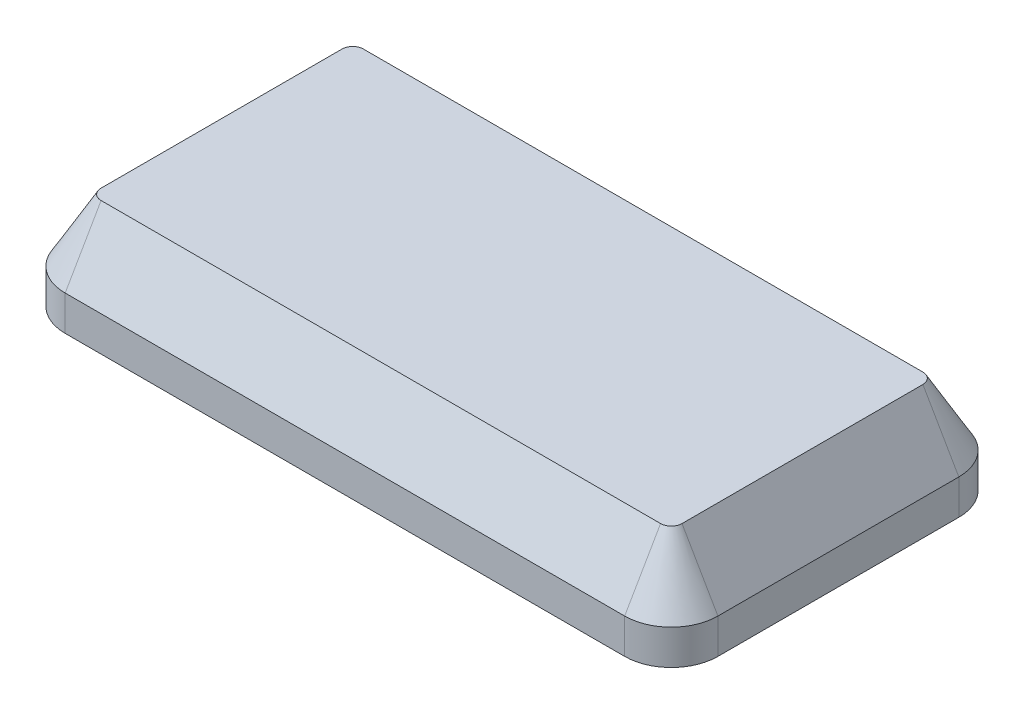
ISO-10303-21;
HEADER;
FILE_DESCRIPTION(('STEP AP214'),'2;1');
FILE_NAME('part.step','',(''),(''),'','','');
FILE_SCHEMA(('AUTOMOTIVE_DESIGN { 1 0 10303 214 1 1 1 1 }'));
ENDSEC;
DATA;
#1=APPLICATION_CONTEXT('core data for automotive mechanical design processes');
#2=APPLICATION_PROTOCOL_DEFINITION('international standard','automotive_design',2000,#1);
#3=PRODUCT_CONTEXT('',#1,'mechanical');
#4=PRODUCT('Part','Part','',(#3));
#5=PRODUCT_RELATED_PRODUCT_CATEGORY('part','',(#4));
#6=PRODUCT_DEFINITION_FORMATION('','',#4);
#7=PRODUCT_DEFINITION_CONTEXT('part definition',#1,'design');
#8=PRODUCT_DEFINITION('design','',#6,#7);
#9=PRODUCT_DEFINITION_SHAPE('','',#8);
#10=(LENGTH_UNIT() NAMED_UNIT(*) SI_UNIT(.MILLI.,.METRE.));
#11=(NAMED_UNIT(*) PLANE_ANGLE_UNIT() SI_UNIT($,.RADIAN.));
#12=(NAMED_UNIT(*) SI_UNIT($,.STERADIAN.) SOLID_ANGLE_UNIT());
#13=UNCERTAINTY_MEASURE_WITH_UNIT(LENGTH_MEASURE(1.E-05),#10,'distance_accuracy_value','');
#14=(GEOMETRIC_REPRESENTATION_CONTEXT(3) GLOBAL_UNCERTAINTY_ASSIGNED_CONTEXT((#13)) GLOBAL_UNIT_ASSIGNED_CONTEXT((#10,
#11,#12)) REPRESENTATION_CONTEXT('',''));
#15=CARTESIAN_POINT('',(0.,0.,0.));
#16=DIRECTION('',(0.,0.,1.));
#17=DIRECTION('',(1.,0.,0.));
#18=AXIS2_PLACEMENT_3D('',#15,#16,#17);
#19=CARTESIAN_POINT('',(36.,4.5,15.5));
#20=DIRECTION('',(0.,-1.,0.));
#21=DIRECTION('',(0.,0.,-1.));
#22=AXIS2_PLACEMENT_3D('',#19,#20,#21);
#23=CYLINDRICAL_SURFACE('',#22,6.);
#24=CARTESIAN_POINT('',(36.,0.,15.5));
#25=DIRECTION('',(0.,1.,0.));
#26=DIRECTION('',(0.,0.,1.));
#27=AXIS2_PLACEMENT_3D('',#24,#25,#26);
#28=CIRCLE('',#27,6.);
#29=CARTESIAN_POINT('',(36.,0.,21.5));
#30=VERTEX_POINT('',#29);
#31=CARTESIAN_POINT('',(42.,0.,15.5));
#32=VERTEX_POINT('',#31);
#33=EDGE_CURVE('E396',#30,#32,#28,.T.);
#34=ORIENTED_EDGE('',*,*,#33,.T.);
#35=DIRECTION('',(0.,-1.,0.));
#36=VECTOR('',#35,1.);
#37=CARTESIAN_POINT('',(42.,4.5,15.5));
#38=LINE('',#37,#36);
#39=CARTESIAN_POINT('',(42.,4.5,15.5));
#40=VERTEX_POINT('',#39);
#41=EDGE_CURVE('E12',#40,#32,#38,.T.);
#42=ORIENTED_EDGE('',*,*,#41,.F.);
#43=CARTESIAN_POINT('',(36.,4.5,15.5));
#44=DIRECTION('',(0.,1.,0.));
#45=DIRECTION('',(0.,0.,1.));
#46=AXIS2_PLACEMENT_3D('',#43,#44,#45);
#47=CIRCLE('',#46,6.);
#48=CARTESIAN_POINT('',(36.,4.5,21.5));
#49=VERTEX_POINT('',#48);
#50=EDGE_CURVE('E416',#49,#40,#47,.T.);
#51=ORIENTED_EDGE('',*,*,#50,.F.);
#52=DIRECTION('',(0.,-1.,0.));
#53=VECTOR('',#52,1.);
#54=CARTESIAN_POINT('',(36.,4.5,21.5));
#55=LINE('',#54,#53);
#56=EDGE_CURVE('E429',#49,#30,#55,.T.);
#57=ORIENTED_EDGE('',*,*,#56,.T.);
#58=EDGE_LOOP('',(#34,#42,#51,#57));
#59=FACE_BOUND('',#58,.T.);
#60=ADVANCED_FACE('F144',(#59),#23,.T.);
#61=CARTESIAN_POINT('',(42.,4.5,-15.5));
#62=DIRECTION('',(-1.,0.,0.));
#63=DIRECTION('',(0.,0.,1.));
#64=AXIS2_PLACEMENT_3D('',#61,#62,#63);
#65=PLANE('',#64);
#66=DIRECTION('',(0.,0.,-1.));
#67=VECTOR('',#66,1.);
#68=CARTESIAN_POINT('',(42.,0.,-15.5));
#69=LINE('',#68,#67);
#70=CARTESIAN_POINT('',(42.,0.,-15.5));
#71=VERTEX_POINT('',#70);
#72=EDGE_CURVE('E432',#32,#71,#69,.T.);
#73=ORIENTED_EDGE('',*,*,#72,.T.);
#74=DIRECTION('',(0.,-1.,0.));
#75=VECTOR('',#74,1.);
#76=CARTESIAN_POINT('',(42.,4.5,-15.5));
#77=LINE('',#76,#75);
#78=CARTESIAN_POINT('',(42.,4.5,-15.5));
#79=VERTEX_POINT('',#78);
#80=EDGE_CURVE('E151',#79,#71,#77,.T.);
#81=ORIENTED_EDGE('',*,*,#80,.F.);
#82=DIRECTION('',(0.,0.,-1.));
#83=VECTOR('',#82,1.);
#84=CARTESIAN_POINT('',(42.,4.5,-15.5));
#85=LINE('',#84,#83);
#86=EDGE_CURVE('E208',#40,#79,#85,.T.);
#87=ORIENTED_EDGE('',*,*,#86,.F.);
#88=ORIENTED_EDGE('',*,*,#41,.T.);
#89=EDGE_LOOP('',(#73,#81,#87,#88));
#90=FACE_BOUND('',#89,.T.);
#91=ADVANCED_FACE('F563',(#90),#65,.F.);
#92=CARTESIAN_POINT('',(36.,4.5,-15.5));
#93=DIRECTION('',(0.,-1.,0.));
#94=DIRECTION('',(0.,0.,-1.));
#95=AXIS2_PLACEMENT_3D('',#92,#93,#94);
#96=CYLINDRICAL_SURFACE('',#95,6.);
#97=CARTESIAN_POINT('',(36.,0.,-15.5));
#98=DIRECTION('',(0.,1.,0.));
#99=DIRECTION('',(0.,0.,-1.));
#100=AXIS2_PLACEMENT_3D('',#97,#98,#99);
#101=CIRCLE('',#100,6.);
#102=CARTESIAN_POINT('',(35.9999999999999,0.,-21.5));
#103=VERTEX_POINT('',#102);
#104=EDGE_CURVE('E434',#71,#103,#101,.T.);
#105=ORIENTED_EDGE('',*,*,#104,.T.);
#106=DIRECTION('',(0.,-1.,0.));
#107=VECTOR('',#106,1.);
#108=CARTESIAN_POINT('',(35.9999999999999,4.5,-21.5));
#109=LINE('',#108,#107);
#110=CARTESIAN_POINT('',(35.9999999999999,4.5,-21.5));
#111=VERTEX_POINT('',#110);
#112=EDGE_CURVE('E448',#111,#103,#109,.T.);
#113=ORIENTED_EDGE('',*,*,#112,.F.);
#114=CARTESIAN_POINT('',(36.,4.5,-15.5));
#115=DIRECTION('',(0.,1.,0.));
#116=DIRECTION('',(0.,0.,-1.));
#117=AXIS2_PLACEMENT_3D('',#114,#115,#116);
#118=CIRCLE('',#117,6.);
#119=EDGE_CURVE('E420',#79,#111,#118,.T.);
#120=ORIENTED_EDGE('',*,*,#119,.F.);
#121=ORIENTED_EDGE('',*,*,#80,.T.);
#122=EDGE_LOOP('',(#105,#113,#120,#121));
#123=FACE_BOUND('',#122,.T.);
#124=ADVANCED_FACE('F454',(#123),#96,.T.);
#125=CARTESIAN_POINT('',(-36.,4.5,-21.5));
#126=DIRECTION('',(0.,0.,1.));
#127=DIRECTION('',(1.,0.,0.));
#128=AXIS2_PLACEMENT_3D('',#125,#126,#127);
#129=PLANE('',#128);
#130=DIRECTION('',(-1.,0.,0.));
#131=VECTOR('',#130,1.);
#132=CARTESIAN_POINT('',(-36.,0.,-21.5));
#133=LINE('',#132,#131);
#134=CARTESIAN_POINT('',(-36.,0.,-21.5));
#135=VERTEX_POINT('',#134);
#136=EDGE_CURVE('E436',#103,#135,#133,.T.);
#137=ORIENTED_EDGE('',*,*,#136,.T.);
#138=DIRECTION('',(0.,-1.,0.));
#139=VECTOR('',#138,1.);
#140=CARTESIAN_POINT('',(-36.,4.5,-21.5));
#141=LINE('',#140,#139);
#142=CARTESIAN_POINT('',(-36.,4.5,-21.5));
#143=VERTEX_POINT('',#142);
#144=EDGE_CURVE('E234',#143,#135,#141,.T.);
#145=ORIENTED_EDGE('',*,*,#144,.F.);
#146=DIRECTION('',(-1.,0.,0.));
#147=VECTOR('',#146,1.);
#148=CARTESIAN_POINT('',(-36.,4.5,-21.5));
#149=LINE('',#148,#147);
#150=EDGE_CURVE('E257',#111,#143,#149,.T.);
#151=ORIENTED_EDGE('',*,*,#150,.F.);
#152=ORIENTED_EDGE('',*,*,#112,.T.);
#153=EDGE_LOOP('',(#137,#145,#151,#152));
#154=FACE_BOUND('',#153,.T.);
#155=ADVANCED_FACE('F460',(#154),#129,.F.);
#156=CARTESIAN_POINT('',(-36.,4.5,-15.5));
#157=DIRECTION('',(0.,-1.,0.));
#158=DIRECTION('',(0.,0.,-1.));
#159=AXIS2_PLACEMENT_3D('',#156,#157,#158);
#160=CYLINDRICAL_SURFACE('',#159,6.);
#161=CARTESIAN_POINT('',(-36.,0.,-15.5));
#162=DIRECTION('',(0.,1.,0.));
#163=DIRECTION('',(0.,0.,1.));
#164=AXIS2_PLACEMENT_3D('',#161,#162,#163);
#165=CIRCLE('',#164,6.);
#166=CARTESIAN_POINT('',(-42.,0.,-15.5));
#167=VERTEX_POINT('',#166);
#168=EDGE_CURVE('E231',#135,#167,#165,.T.);
#169=ORIENTED_EDGE('',*,*,#168,.T.);
#170=DIRECTION('',(0.,-1.,0.));
#171=VECTOR('',#170,1.);
#172=CARTESIAN_POINT('',(-42.,4.5,-15.5));
#173=LINE('',#172,#171);
#174=CARTESIAN_POINT('',(-42.,4.5,-15.5));
#175=VERTEX_POINT('',#174);
#176=EDGE_CURVE('E223',#175,#167,#173,.T.);
#177=ORIENTED_EDGE('',*,*,#176,.F.);
#178=CARTESIAN_POINT('',(-36.,4.5,-15.5));
#179=DIRECTION('',(0.,1.,0.));
#180=DIRECTION('',(0.,0.,1.));
#181=AXIS2_PLACEMENT_3D('',#178,#179,#180);
#182=CIRCLE('',#181,6.);
#183=EDGE_CURVE('E228',#143,#175,#182,.T.);
#184=ORIENTED_EDGE('',*,*,#183,.F.);
#185=ORIENTED_EDGE('',*,*,#144,.T.);
#186=EDGE_LOOP('',(#169,#177,#184,#185));
#187=FACE_BOUND('',#186,.T.);
#188=ADVANCED_FACE('F225',(#187),#160,.T.);
#189=CARTESIAN_POINT('',(-42.,4.5,-15.5));
#190=DIRECTION('',(1.,0.,0.));
#191=DIRECTION('',(0.,0.,-1.));
#192=AXIS2_PLACEMENT_3D('',#189,#190,#191);
#193=PLANE('',#192);
#194=DIRECTION('',(0.,0.,1.));
#195=VECTOR('',#194,1.);
#196=CARTESIAN_POINT('',(-42.,0.,-15.5));
#197=LINE('',#196,#195);
#198=CARTESIAN_POINT('',(-42.,0.,15.5));
#199=VERTEX_POINT('',#198);
#200=EDGE_CURVE('E439',#167,#199,#197,.T.);
#201=ORIENTED_EDGE('',*,*,#200,.T.);
#202=DIRECTION('',(0.,-1.,0.));
#203=VECTOR('',#202,1.);
#204=CARTESIAN_POINT('',(-42.,4.5,15.5));
#205=LINE('',#204,#203);
#206=CARTESIAN_POINT('',(-42.,4.5,15.5));
#207=VERTEX_POINT('',#206);
#208=EDGE_CURVE('E235',#207,#199,#205,.T.);
#209=ORIENTED_EDGE('',*,*,#208,.F.);
#210=DIRECTION('',(0.,0.,1.));
#211=VECTOR('',#210,1.);
#212=CARTESIAN_POINT('',(-42.,4.5,-15.5));
#213=LINE('',#212,#211);
#214=EDGE_CURVE('E238',#175,#207,#213,.T.);
#215=ORIENTED_EDGE('',*,*,#214,.F.);
#216=ORIENTED_EDGE('',*,*,#176,.T.);
#217=EDGE_LOOP('',(#201,#209,#215,#216));
#218=FACE_BOUND('',#217,.T.);
#219=ADVANCED_FACE('F239',(#218),#193,.F.);
#220=CARTESIAN_POINT('',(-36.,4.5,15.5));
#221=DIRECTION('',(0.,-1.,0.));
#222=DIRECTION('',(0.,0.,-1.));
#223=AXIS2_PLACEMENT_3D('',#220,#221,#222);
#224=CYLINDRICAL_SURFACE('',#223,6.);
#225=CARTESIAN_POINT('',(-36.,0.,15.5));
#226=DIRECTION('',(0.,1.,0.));
#227=DIRECTION('',(0.,0.,1.));
#228=AXIS2_PLACEMENT_3D('',#225,#226,#227);
#229=CIRCLE('',#228,6.);
#230=CARTESIAN_POINT('',(-36.,0.,21.5));
#231=VERTEX_POINT('',#230);
#232=EDGE_CURVE('E441',#199,#231,#229,.T.);
#233=ORIENTED_EDGE('',*,*,#232,.T.);
#234=DIRECTION('',(0.,-1.,0.));
#235=VECTOR('',#234,1.);
#236=CARTESIAN_POINT('',(-36.,4.5,21.5));
#237=LINE('',#236,#235);
#238=CARTESIAN_POINT('',(-36.,4.5,21.5));
#239=VERTEX_POINT('',#238);
#240=EDGE_CURVE('E167',#239,#231,#237,.T.);
#241=ORIENTED_EDGE('',*,*,#240,.F.);
#242=CARTESIAN_POINT('',(-36.,4.5,15.5));
#243=DIRECTION('',(0.,1.,0.));
#244=DIRECTION('',(0.,0.,1.));
#245=AXIS2_PLACEMENT_3D('',#242,#243,#244);
#246=CIRCLE('',#245,6.);
#247=EDGE_CURVE('E245',#207,#239,#246,.T.);
#248=ORIENTED_EDGE('',*,*,#247,.F.);
#249=ORIENTED_EDGE('',*,*,#208,.T.);
#250=EDGE_LOOP('',(#233,#241,#248,#249));
#251=FACE_BOUND('',#250,.T.);
#252=ADVANCED_FACE('F571',(#251),#224,.T.);
#253=CARTESIAN_POINT('',(-36.,4.5,21.5));
#254=DIRECTION('',(0.,0.,-1.));
#255=DIRECTION('',(-1.,0.,0.));
#256=AXIS2_PLACEMENT_3D('',#253,#254,#255);
#257=PLANE('',#256);
#258=DIRECTION('',(1.,0.,0.));
#259=VECTOR('',#258,1.);
#260=CARTESIAN_POINT('',(-36.,0.,21.5));
#261=LINE('',#260,#259);
#262=EDGE_CURVE('E200',#231,#30,#261,.T.);
#263=ORIENTED_EDGE('',*,*,#262,.T.);
#264=ORIENTED_EDGE('',*,*,#56,.F.);
#265=DIRECTION('',(1.,0.,0.));
#266=VECTOR('',#265,1.);
#267=CARTESIAN_POINT('',(-36.,4.5,21.5));
#268=LINE('',#267,#266);
#269=EDGE_CURVE('E426',#239,#49,#268,.T.);
#270=ORIENTED_EDGE('',*,*,#269,.F.);
#271=ORIENTED_EDGE('',*,*,#240,.T.);
#272=EDGE_LOOP('',(#263,#264,#270,#271));
#273=FACE_BOUND('',#272,.T.);
#274=ADVANCED_FACE('F572',(#273),#257,.F.);
#275=CARTESIAN_POINT('',(36.,0.,15.5));
#276=DIRECTION('',(0.,1.,0.));
#277=DIRECTION('',(0.,0.,1.));
#278=AXIS2_PLACEMENT_3D('',#275,#276,#277);
#279=PLANE('',#278);
#280=DIRECTION('',(-1.,0.,0.));
#281=VECTOR('',#280,1.);
#282=CARTESIAN_POINT('',(36.,0.,20.5));
#283=LINE('',#282,#281);
#284=CARTESIAN_POINT('',(36.,0.,20.5));
#285=VERTEX_POINT('',#284);
#286=CARTESIAN_POINT('',(-36.,0.,20.5));
#287=VERTEX_POINT('',#286);
#288=EDGE_CURVE('E372',#285,#287,#283,.T.);
#289=ORIENTED_EDGE('',*,*,#288,.F.);
#290=CARTESIAN_POINT('',(36.,0.,15.5));
#291=DIRECTION('',(0.,-1.,0.));
#292=DIRECTION('',(0.,0.,-1.));
#293=AXIS2_PLACEMENT_3D('',#290,#291,#292);
#294=CIRCLE('',#293,5.);
#295=CARTESIAN_POINT('',(41.,0.,15.5));
#296=VERTEX_POINT('',#295);
#297=EDGE_CURVE('E158',#296,#285,#294,.T.);
#298=ORIENTED_EDGE('',*,*,#297,.F.);
#299=DIRECTION('',(0.,0.,1.));
#300=VECTOR('',#299,1.);
#301=CARTESIAN_POINT('',(41.,0.,-15.5));
#302=LINE('',#301,#300);
#303=CARTESIAN_POINT('',(41.,0.,-15.5));
#304=VERTEX_POINT('',#303);
#305=EDGE_CURVE('E390',#304,#296,#302,.T.);
#306=ORIENTED_EDGE('',*,*,#305,.F.);
#307=CARTESIAN_POINT('',(36.,0.,-15.5));
#308=DIRECTION('',(0.,-1.,0.));
#309=DIRECTION('',(0.,0.,-1.));
#310=AXIS2_PLACEMENT_3D('',#307,#308,#309);
#311=CIRCLE('',#310,5.);
#312=CARTESIAN_POINT('',(35.9999999999999,0.,-20.5));
#313=VERTEX_POINT('',#312);
#314=EDGE_CURVE('E387',#313,#304,#311,.T.);
#315=ORIENTED_EDGE('',*,*,#314,.F.);
#316=DIRECTION('',(1.,0.,0.));
#317=VECTOR('',#316,1.);
#318=CARTESIAN_POINT('',(-36.,0.,-20.5));
#319=LINE('',#318,#317);
#320=CARTESIAN_POINT('',(-36.,0.,-20.5));
#321=VERTEX_POINT('',#320);
#322=EDGE_CURVE('E384',#321,#313,#319,.T.);
#323=ORIENTED_EDGE('',*,*,#322,.F.);
#324=CARTESIAN_POINT('',(-36.,0.,-15.5));
#325=DIRECTION('',(0.,-1.,0.));
#326=DIRECTION('',(0.,0.,-1.));
#327=AXIS2_PLACEMENT_3D('',#324,#325,#326);
#328=CIRCLE('',#327,5.);
#329=CARTESIAN_POINT('',(-41.,0.,-15.5));
#330=VERTEX_POINT('',#329);
#331=EDGE_CURVE('E381',#330,#321,#328,.T.);
#332=ORIENTED_EDGE('',*,*,#331,.F.);
#333=DIRECTION('',(0.,0.,-1.));
#334=VECTOR('',#333,1.);
#335=CARTESIAN_POINT('',(-41.,0.,15.5));
#336=LINE('',#335,#334);
#337=CARTESIAN_POINT('',(-41.,0.,15.5));
#338=VERTEX_POINT('',#337);
#339=EDGE_CURVE('E378',#338,#330,#336,.T.);
#340=ORIENTED_EDGE('',*,*,#339,.F.);
#341=CARTESIAN_POINT('',(-36.,0.,15.5));
#342=DIRECTION('',(0.,-1.,0.));
#343=DIRECTION('',(0.,0.,-1.));
#344=AXIS2_PLACEMENT_3D('',#341,#342,#343);
#345=CIRCLE('',#344,5.);
#346=EDGE_CURVE('E375',#287,#338,#345,.T.);
#347=ORIENTED_EDGE('',*,*,#346,.F.);
#348=EDGE_LOOP('',(#289,#298,#306,#315,#323,#332,#340,#347));
#349=FACE_BOUND('',#348,.T.);
#350=ORIENTED_EDGE('',*,*,#33,.F.);
#351=ORIENTED_EDGE('',*,*,#262,.F.);
#352=ORIENTED_EDGE('',*,*,#232,.F.);
#353=ORIENTED_EDGE('',*,*,#200,.F.);
#354=ORIENTED_EDGE('',*,*,#168,.F.);
#355=ORIENTED_EDGE('',*,*,#136,.F.);
#356=ORIENTED_EDGE('',*,*,#104,.F.);
#357=ORIENTED_EDGE('',*,*,#72,.F.);
#358=EDGE_LOOP('',(#350,#351,#352,#353,#354,#355,#356,#357));
#359=FACE_BOUND('',#358,.T.);
#360=ADVANCED_FACE('F458',(#349,#359),#279,.F.);
#361=CARTESIAN_POINT('',(36.,1.,15.5));
#362=DIRECTION('',(0.,-1.,0.));
#363=DIRECTION('',(0.,0.,-1.));
#364=AXIS2_PLACEMENT_3D('',#361,#362,#363);
#365=CYLINDRICAL_SURFACE('',#364,5.);
#366=ORIENTED_EDGE('',*,*,#297,.T.);
#367=DIRECTION('',(0.,-1.,0.));
#368=VECTOR('',#367,1.);
#369=CARTESIAN_POINT('',(36.,1.,20.5));
#370=LINE('',#369,#368);
#371=CARTESIAN_POINT('',(36.,4.4,20.5));
#372=VERTEX_POINT('',#371);
#373=EDGE_CURVE('E393',#372,#285,#370,.T.);
#374=ORIENTED_EDGE('',*,*,#373,.F.);
#375=CARTESIAN_POINT('',(36.,4.4,15.5));
#376=DIRECTION('',(0.,-1.,0.));
#377=DIRECTION('',(0.,0.,-1.));
#378=AXIS2_PLACEMENT_3D('',#375,#376,#377);
#379=CIRCLE('',#378,5.);
#380=CARTESIAN_POINT('',(41.,4.4,15.5));
#381=VERTEX_POINT('',#380);
#382=EDGE_CURVE('E334',#381,#372,#379,.T.);
#383=ORIENTED_EDGE('',*,*,#382,.F.);
#384=DIRECTION('',(0.,-1.,0.));
#385=VECTOR('',#384,1.);
#386=CARTESIAN_POINT('',(41.,1.,15.5));
#387=LINE('',#386,#385);
#388=EDGE_CURVE('E394',#381,#296,#387,.T.);
#389=ORIENTED_EDGE('',*,*,#388,.T.);
#390=EDGE_LOOP('',(#366,#374,#383,#389));
#391=FACE_BOUND('',#390,.T.);
#392=ADVANCED_FACE('F522',(#391),#365,.F.);
#393=CARTESIAN_POINT('',(41.,1.,-15.5));
#394=DIRECTION('',(1.,0.,0.));
#395=DIRECTION('',(0.,0.,-1.));
#396=AXIS2_PLACEMENT_3D('',#393,#394,#395);
#397=PLANE('',#396);
#398=ORIENTED_EDGE('',*,*,#305,.T.);
#399=ORIENTED_EDGE('',*,*,#388,.F.);
#400=DIRECTION('',(0.,0.,1.));
#401=VECTOR('',#400,1.);
#402=CARTESIAN_POINT('',(41.,4.4,0.));
#403=LINE('',#402,#401);
#404=CARTESIAN_POINT('',(41.,4.4,-15.5));
#405=VERTEX_POINT('',#404);
#406=EDGE_CURVE('E331',#405,#381,#403,.T.);
#407=ORIENTED_EDGE('',*,*,#406,.F.);
#408=DIRECTION('',(0.,-1.,0.));
#409=VECTOR('',#408,1.);
#410=CARTESIAN_POINT('',(41.,1.,-15.5));
#411=LINE('',#410,#409);
#412=EDGE_CURVE('E397',#405,#304,#411,.T.);
#413=ORIENTED_EDGE('',*,*,#412,.T.);
#414=EDGE_LOOP('',(#398,#399,#407,#413));
#415=FACE_BOUND('',#414,.T.);
#416=ADVANCED_FACE('F524',(#415),#397,.F.);
#417=CARTESIAN_POINT('',(36.,1.,-15.5));
#418=DIRECTION('',(0.,-1.,0.));
#419=DIRECTION('',(0.,0.,-1.));
#420=AXIS2_PLACEMENT_3D('',#417,#418,#419);
#421=CYLINDRICAL_SURFACE('',#420,5.);
#422=ORIENTED_EDGE('',*,*,#314,.T.);
#423=ORIENTED_EDGE('',*,*,#412,.F.);
#424=CARTESIAN_POINT('',(36.,4.4,-15.5));
#425=DIRECTION('',(0.,-1.,0.));
#426=DIRECTION('',(0.,0.,-1.));
#427=AXIS2_PLACEMENT_3D('',#424,#425,#426);
#428=CIRCLE('',#427,5.);
#429=CARTESIAN_POINT('',(36.,4.4,-20.5));
#430=VERTEX_POINT('',#429);
#431=EDGE_CURVE('E352',#430,#405,#428,.T.);
#432=ORIENTED_EDGE('',*,*,#431,.F.);
#433=DIRECTION('',(0.,-1.,0.));
#434=VECTOR('',#433,1.);
#435=CARTESIAN_POINT('',(35.9999999999999,1.,-20.5));
#436=LINE('',#435,#434);
#437=EDGE_CURVE('E400',#430,#313,#436,.T.);
#438=ORIENTED_EDGE('',*,*,#437,.T.);
#439=EDGE_LOOP('',(#422,#423,#432,#438));
#440=FACE_BOUND('',#439,.T.);
#441=ADVANCED_FACE('F540',(#440),#421,.F.);
#442=CARTESIAN_POINT('',(-36.,1.,-20.5));
#443=DIRECTION('',(0.,0.,-1.));
#444=DIRECTION('',(-1.,0.,0.));
#445=AXIS2_PLACEMENT_3D('',#442,#443,#444);
#446=PLANE('',#445);
#447=ORIENTED_EDGE('',*,*,#322,.T.);
#448=ORIENTED_EDGE('',*,*,#437,.F.);
#449=DIRECTION('',(1.,0.,0.));
#450=VECTOR('',#449,1.);
#451=CARTESIAN_POINT('',(0.,4.4,-20.5));
#452=LINE('',#451,#450);
#453=CARTESIAN_POINT('',(-36.,4.4,-20.5));
#454=VERTEX_POINT('',#453);
#455=EDGE_CURVE('E349',#454,#430,#452,.T.);
#456=ORIENTED_EDGE('',*,*,#455,.F.);
#457=DIRECTION('',(0.,-1.,0.));
#458=VECTOR('',#457,1.);
#459=CARTESIAN_POINT('',(-36.,1.,-20.5));
#460=LINE('',#459,#458);
#461=EDGE_CURVE('E403',#454,#321,#460,.T.);
#462=ORIENTED_EDGE('',*,*,#461,.T.);
#463=EDGE_LOOP('',(#447,#448,#456,#462));
#464=FACE_BOUND('',#463,.T.);
#465=ADVANCED_FACE('F544',(#464),#446,.F.);
#466=CARTESIAN_POINT('',(-36.,1.,-15.5));
#467=DIRECTION('',(0.,-1.,0.));
#468=DIRECTION('',(0.,0.,-1.));
#469=AXIS2_PLACEMENT_3D('',#466,#467,#468);
#470=CYLINDRICAL_SURFACE('',#469,5.);
#471=ORIENTED_EDGE('',*,*,#331,.T.);
#472=ORIENTED_EDGE('',*,*,#461,.F.);
#473=CARTESIAN_POINT('',(-36.,4.4,-15.5));
#474=DIRECTION('',(0.,-1.,0.));
#475=DIRECTION('',(0.,0.,-1.));
#476=AXIS2_PLACEMENT_3D('',#473,#474,#475);
#477=CIRCLE('',#476,5.);
#478=CARTESIAN_POINT('',(-41.,4.4,-15.5));
#479=VERTEX_POINT('',#478);
#480=EDGE_CURVE('E346',#479,#454,#477,.T.);
#481=ORIENTED_EDGE('',*,*,#480,.F.);
#482=DIRECTION('',(0.,-1.,0.));
#483=VECTOR('',#482,1.);
#484=CARTESIAN_POINT('',(-41.,1.,-15.5));
#485=LINE('',#484,#483);
#486=EDGE_CURVE('E406',#479,#330,#485,.T.);
#487=ORIENTED_EDGE('',*,*,#486,.T.);
#488=EDGE_LOOP('',(#471,#472,#481,#487));
#489=FACE_BOUND('',#488,.T.);
#490=ADVANCED_FACE('F547',(#489),#470,.F.);
#491=CARTESIAN_POINT('',(-41.,1.,15.5));
#492=DIRECTION('',(-1.,0.,0.));
#493=DIRECTION('',(0.,0.,1.));
#494=AXIS2_PLACEMENT_3D('',#491,#492,#493);
#495=PLANE('',#494);
#496=ORIENTED_EDGE('',*,*,#339,.T.);
#497=ORIENTED_EDGE('',*,*,#486,.F.);
#498=DIRECTION('',(0.,0.,-1.));
#499=VECTOR('',#498,1.);
#500=CARTESIAN_POINT('',(-41.,4.4,0.));
#501=LINE('',#500,#499);
#502=CARTESIAN_POINT('',(-41.,4.4,15.5));
#503=VERTEX_POINT('',#502);
#504=EDGE_CURVE('E343',#503,#479,#501,.T.);
#505=ORIENTED_EDGE('',*,*,#504,.F.);
#506=DIRECTION('',(0.,-1.,0.));
#507=VECTOR('',#506,1.);
#508=CARTESIAN_POINT('',(-41.,1.,15.5));
#509=LINE('',#508,#507);
#510=EDGE_CURVE('E409',#503,#338,#509,.T.);
#511=ORIENTED_EDGE('',*,*,#510,.T.);
#512=EDGE_LOOP('',(#496,#497,#505,#511));
#513=FACE_BOUND('',#512,.T.);
#514=ADVANCED_FACE('F550',(#513),#495,.F.);
#515=CARTESIAN_POINT('',(-36.,1.,15.5));
#516=DIRECTION('',(0.,-1.,0.));
#517=DIRECTION('',(0.,0.,-1.));
#518=AXIS2_PLACEMENT_3D('',#515,#516,#517);
#519=CYLINDRICAL_SURFACE('',#518,5.);
#520=ORIENTED_EDGE('',*,*,#346,.T.);
#521=ORIENTED_EDGE('',*,*,#510,.F.);
#522=CARTESIAN_POINT('',(-36.,4.4,15.5));
#523=DIRECTION('',(0.,-1.,0.));
#524=DIRECTION('',(0.,0.,-1.));
#525=AXIS2_PLACEMENT_3D('',#522,#523,#524);
#526=CIRCLE('',#525,5.);
#527=CARTESIAN_POINT('',(-36.,4.4,20.5));
#528=VERTEX_POINT('',#527);
#529=EDGE_CURVE('E340',#528,#503,#526,.T.);
#530=ORIENTED_EDGE('',*,*,#529,.F.);
#531=DIRECTION('',(0.,-1.,0.));
#532=VECTOR('',#531,1.);
#533=CARTESIAN_POINT('',(-36.,1.,20.5));
#534=LINE('',#533,#532);
#535=EDGE_CURVE('E412',#528,#287,#534,.T.);
#536=ORIENTED_EDGE('',*,*,#535,.T.);
#537=EDGE_LOOP('',(#520,#521,#530,#536));
#538=FACE_BOUND('',#537,.T.);
#539=ADVANCED_FACE('F552',(#538),#519,.F.);
#540=CARTESIAN_POINT('',(36.,1.,20.5));
#541=DIRECTION('',(0.,0.,1.));
#542=DIRECTION('',(1.,0.,0.));
#543=AXIS2_PLACEMENT_3D('',#540,#541,#542);
#544=PLANE('',#543);
#545=ORIENTED_EDGE('',*,*,#288,.T.);
#546=ORIENTED_EDGE('',*,*,#535,.F.);
#547=DIRECTION('',(-1.,0.,0.));
#548=VECTOR('',#547,1.);
#549=CARTESIAN_POINT('',(0.,4.4,20.5));
#550=LINE('',#549,#548);
#551=EDGE_CURVE('E337',#372,#528,#550,.T.);
#552=ORIENTED_EDGE('',*,*,#551,.F.);
#553=ORIENTED_EDGE('',*,*,#373,.T.);
#554=EDGE_LOOP('',(#545,#546,#552,#553));
#555=FACE_BOUND('',#554,.T.);
#556=ADVANCED_FACE('F531',(#555),#544,.F.);
#557=CARTESIAN_POINT('',(36.,4.4,-15.5));
#558=DIRECTION('',(0.,-1.,0.));
#559=DIRECTION('',(0.,0.,-1.));
#560=AXIS2_PLACEMENT_3D('',#557,#558,#559);
#561=CYLINDRICAL_SURFACE('',#560,2.5);
#562=CARTESIAN_POINT('',(36.,4.4,-15.5));
#563=DIRECTION('',(0.,-1.,0.));
#564=DIRECTION('',(0.,0.,-1.));
#565=AXIS2_PLACEMENT_3D('',#562,#563,#564);
#566=CIRCLE('',#565,2.5);
#567=CARTESIAN_POINT('',(36.,4.4,-18.));
#568=VERTEX_POINT('',#567);
#569=EDGE_CURVE('E355',#568,#568,#566,.T.);
#570=ORIENTED_EDGE('',*,*,#569,.T.);
#571=EDGE_LOOP('',(#570));
#572=FACE_BOUND('',#571,.T.);
#573=CARTESIAN_POINT('',(36.,1.,-15.5));
#574=DIRECTION('',(0.,-1.,0.));
#575=DIRECTION('',(0.,0.,-1.));
#576=AXIS2_PLACEMENT_3D('',#573,#574,#575);
#577=CIRCLE('',#576,2.5);
#578=CARTESIAN_POINT('',(36.,1.,-18.));
#579=VERTEX_POINT('',#578);
#580=EDGE_CURVE('E366',#579,#579,#577,.T.);
#581=ORIENTED_EDGE('',*,*,#580,.F.);
#582=EDGE_LOOP('',(#581));
#583=FACE_BOUND('',#582,.T.);
#584=ADVANCED_FACE('F559',(#572,#583),#561,.T.);
#585=CARTESIAN_POINT('',(-36.,4.4,15.5));
#586=DIRECTION('',(0.,-1.,0.));
#587=DIRECTION('',(0.,0.,-1.));
#588=AXIS2_PLACEMENT_3D('',#585,#586,#587);
#589=CYLINDRICAL_SURFACE('',#588,2.5);
#590=CARTESIAN_POINT('',(-36.,4.4,15.5));
#591=DIRECTION('',(0.,-1.,0.));
#592=DIRECTION('',(0.,0.,-1.));
#593=AXIS2_PLACEMENT_3D('',#590,#591,#592);
#594=CIRCLE('',#593,2.5);
#595=CARTESIAN_POINT('',(-36.,4.4,13.));
#596=VERTEX_POINT('',#595);
#597=EDGE_CURVE('E327',#596,#596,#594,.T.);
#598=ORIENTED_EDGE('',*,*,#597,.T.);
#599=EDGE_LOOP('',(#598));
#600=FACE_BOUND('',#599,.T.);
#601=CARTESIAN_POINT('',(-36.,1.,15.5));
#602=DIRECTION('',(0.,-1.,0.));
#603=DIRECTION('',(0.,0.,-1.));
#604=AXIS2_PLACEMENT_3D('',#601,#602,#603);
#605=CIRCLE('',#604,2.5);
#606=CARTESIAN_POINT('',(-36.,1.,13.));
#607=VERTEX_POINT('',#606);
#608=EDGE_CURVE('E363',#607,#607,#605,.T.);
#609=ORIENTED_EDGE('',*,*,#608,.F.);
#610=EDGE_LOOP('',(#609));
#611=FACE_BOUND('',#610,.T.);
#612=ADVANCED_FACE('F662',(#600,#611),#589,.T.);
#613=CARTESIAN_POINT('',(-36.,4.4,-15.5));
#614=DIRECTION('',(0.,-1.,0.));
#615=DIRECTION('',(0.,0.,-1.));
#616=AXIS2_PLACEMENT_3D('',#613,#614,#615);
#617=CYLINDRICAL_SURFACE('',#616,2.5);
#618=CARTESIAN_POINT('',(-36.,4.4,-15.5));
#619=DIRECTION('',(0.,-1.,0.));
#620=DIRECTION('',(0.,0.,-1.));
#621=AXIS2_PLACEMENT_3D('',#618,#619,#620);
#622=CIRCLE('',#621,2.5);
#623=CARTESIAN_POINT('',(-36.,4.4,-18.));
#624=VERTEX_POINT('',#623);
#625=EDGE_CURVE('E324',#624,#624,#622,.F.);
#626=ORIENTED_EDGE('',*,*,#625,.F.);
#627=EDGE_LOOP('',(#626));
#628=FACE_BOUND('',#627,.T.);
#629=CARTESIAN_POINT('',(-36.,1.,-15.5));
#630=DIRECTION('',(0.,-1.,0.));
#631=DIRECTION('',(0.,0.,-1.));
#632=AXIS2_PLACEMENT_3D('',#629,#630,#631);
#633=CIRCLE('',#632,2.5);
#634=CARTESIAN_POINT('',(-36.,1.,-18.));
#635=VERTEX_POINT('',#634);
#636=EDGE_CURVE('E302',#635,#635,#633,.F.);
#637=ORIENTED_EDGE('',*,*,#636,.T.);
#638=EDGE_LOOP('',(#637));
#639=FACE_BOUND('',#638,.T.);
#640=ADVANCED_FACE('F658',(#628,#639),#617,.T.);
#641=CARTESIAN_POINT('',(36.,4.4,15.5));
#642=DIRECTION('',(0.,-1.,0.));
#643=DIRECTION('',(0.,0.,-1.));
#644=AXIS2_PLACEMENT_3D('',#641,#642,#643);
#645=CYLINDRICAL_SURFACE('',#644,2.5);
#646=CARTESIAN_POINT('',(36.,4.4,15.5));
#647=DIRECTION('',(0.,-1.,0.));
#648=DIRECTION('',(0.,0.,-1.));
#649=AXIS2_PLACEMENT_3D('',#646,#647,#648);
#650=CIRCLE('',#649,2.5);
#651=CARTESIAN_POINT('',(36.,4.4,13.));
#652=VERTEX_POINT('',#651);
#653=EDGE_CURVE('E358',#652,#652,#650,.F.);
#654=ORIENTED_EDGE('',*,*,#653,.F.);
#655=EDGE_LOOP('',(#654));
#656=FACE_BOUND('',#655,.T.);
#657=CARTESIAN_POINT('',(36.,1.,15.5));
#658=DIRECTION('',(0.,-1.,0.));
#659=DIRECTION('',(0.,0.,-1.));
#660=AXIS2_PLACEMENT_3D('',#657,#658,#659);
#661=CIRCLE('',#660,2.5);
#662=CARTESIAN_POINT('',(36.,1.,13.));
#663=VERTEX_POINT('',#662);
#664=EDGE_CURVE('E328',#663,#663,#661,.F.);
#665=ORIENTED_EDGE('',*,*,#664,.T.);
#666=EDGE_LOOP('',(#665));
#667=FACE_BOUND('',#666,.T.);
#668=ADVANCED_FACE('F654',(#656,#667),#645,.T.);
#669=CARTESIAN_POINT('',(0.,4.4,0.));
#670=DIRECTION('',(0.,-1.,0.));
#671=DIRECTION('',(0.,0.,-1.));
#672=AXIS2_PLACEMENT_3D('',#669,#670,#671);
#673=PLANE('',#672);
#674=ORIENTED_EDGE('',*,*,#625,.T.);
#675=EDGE_LOOP('',(#674));
#676=FACE_BOUND('',#675,.T.);
#677=ORIENTED_EDGE('',*,*,#597,.F.);
#678=EDGE_LOOP('',(#677));
#679=FACE_BOUND('',#678,.T.);
#680=ORIENTED_EDGE('',*,*,#406,.T.);
#681=ORIENTED_EDGE('',*,*,#382,.T.);
#682=ORIENTED_EDGE('',*,*,#551,.T.);
#683=ORIENTED_EDGE('',*,*,#529,.T.);
#684=ORIENTED_EDGE('',*,*,#504,.T.);
#685=ORIENTED_EDGE('',*,*,#480,.T.);
#686=ORIENTED_EDGE('',*,*,#455,.T.);
#687=ORIENTED_EDGE('',*,*,#431,.T.);
#688=EDGE_LOOP('',(#680,#681,#682,#683,#684,#685,#686,#687));
#689=FACE_BOUND('',#688,.T.);
#690=ORIENTED_EDGE('',*,*,#569,.F.);
#691=EDGE_LOOP('',(#690));
#692=FACE_BOUND('',#691,.T.);
#693=ORIENTED_EDGE('',*,*,#653,.T.);
#694=EDGE_LOOP('',(#693));
#695=FACE_BOUND('',#694,.T.);
#696=ADVANCED_FACE('F535',(#676,#679,#689,#692,#695),#673,.T.);
#697=CARTESIAN_POINT('',(36.,1.,15.5));
#698=DIRECTION('',(0.,-1.,0.));
#699=DIRECTION('',(0.,0.,-1.));
#700=AXIS2_PLACEMENT_3D('',#697,#698,#699);
#701=PLANE('',#700);
#702=CARTESIAN_POINT('',(-36.,1.,-15.5));
#703=DIRECTION('',(0.,-1.,0.));
#704=DIRECTION('',(0.,0.,-1.));
#705=AXIS2_PLACEMENT_3D('',#702,#703,#704);
#706=CIRCLE('',#705,1.65);
#707=CARTESIAN_POINT('',(-36.,1.,-17.15));
#708=VERTEX_POINT('',#707);
#709=EDGE_CURVE('E303',#708,#708,#706,.F.);
#710=ORIENTED_EDGE('',*,*,#709,.T.);
#711=EDGE_LOOP('',(#710));
#712=FACE_BOUND('',#711,.T.);
#713=ORIENTED_EDGE('',*,*,#636,.F.);
#714=EDGE_LOOP('',(#713));
#715=FACE_BOUND('',#714,.T.);
#716=ADVANCED_FACE('F629',(#712,#715),#701,.T.);
#717=CARTESIAN_POINT('',(-36.,4.4,-15.5));
#718=DIRECTION('',(0.,-1.,0.));
#719=DIRECTION('',(0.,0.,-1.));
#720=AXIS2_PLACEMENT_3D('',#717,#718,#719);
#721=CYLINDRICAL_SURFACE('',#720,1.65);
#722=CARTESIAN_POINT('',(-36.,4.4,-15.5));
#723=DIRECTION('',(0.,-1.,0.));
#724=DIRECTION('',(0.,0.,-1.));
#725=AXIS2_PLACEMENT_3D('',#722,#723,#724);
#726=CIRCLE('',#725,1.65);
#727=CARTESIAN_POINT('',(-36.,4.4,-17.15));
#728=VERTEX_POINT('',#727);
#729=EDGE_CURVE('E299',#728,#728,#726,.F.);
#730=ORIENTED_EDGE('',*,*,#729,.T.);
#731=EDGE_LOOP('',(#730));
#732=FACE_BOUND('',#731,.T.);
#733=ORIENTED_EDGE('',*,*,#709,.F.);
#734=EDGE_LOOP('',(#733));
#735=FACE_BOUND('',#734,.T.);
#736=ADVANCED_FACE('F625',(#732,#735),#721,.F.);
#737=CARTESIAN_POINT('',(0.,4.4,0.));
#738=DIRECTION('',(0.,-1.,0.));
#739=DIRECTION('',(0.,0.,-1.));
#740=AXIS2_PLACEMENT_3D('',#737,#738,#739);
#741=PLANE('',#740);
#742=ORIENTED_EDGE('',*,*,#729,.F.);
#743=EDGE_LOOP('',(#742));
#744=FACE_BOUND('',#743,.T.);
#745=ADVANCED_FACE('F621',(#744),#741,.T.);
#746=ORIENTED_EDGE('',*,*,#608,.T.);
#747=EDGE_LOOP('',(#746));
#748=FACE_BOUND('',#747,.T.);
#749=CARTESIAN_POINT('',(-36.,1.,15.5));
#750=DIRECTION('',(0.,-1.,0.));
#751=DIRECTION('',(0.,0.,-1.));
#752=AXIS2_PLACEMENT_3D('',#749,#750,#751);
#753=CIRCLE('',#752,1.65);
#754=CARTESIAN_POINT('',(-36.,1.,13.85));
#755=VERTEX_POINT('',#754);
#756=EDGE_CURVE('E309',#755,#755,#753,.T.);
#757=ORIENTED_EDGE('',*,*,#756,.F.);
#758=EDGE_LOOP('',(#757));
#759=FACE_BOUND('',#758,.T.);
#760=ADVANCED_FACE('F624',(#748,#759),#701,.T.);
#761=CARTESIAN_POINT('',(-36.,4.4,15.5));
#762=DIRECTION('',(0.,-1.,0.));
#763=DIRECTION('',(0.,0.,-1.));
#764=AXIS2_PLACEMENT_3D('',#761,#762,#763);
#765=CYLINDRICAL_SURFACE('',#764,1.65);
#766=CARTESIAN_POINT('',(-36.,4.4,15.5));
#767=DIRECTION('',(0.,-1.,0.));
#768=DIRECTION('',(0.,0.,-1.));
#769=AXIS2_PLACEMENT_3D('',#766,#767,#768);
#770=CIRCLE('',#769,1.65);
#771=CARTESIAN_POINT('',(-36.,4.4,13.85));
#772=VERTEX_POINT('',#771);
#773=EDGE_CURVE('E306',#772,#772,#770,.T.);
#774=ORIENTED_EDGE('',*,*,#773,.F.);
#775=EDGE_LOOP('',(#774));
#776=FACE_BOUND('',#775,.T.);
#777=ORIENTED_EDGE('',*,*,#756,.T.);
#778=EDGE_LOOP('',(#777));
#779=FACE_BOUND('',#778,.T.);
#780=ADVANCED_FACE('F635',(#776,#779),#765,.F.);
#781=CARTESIAN_POINT('',(0.,4.4,0.));
#782=DIRECTION('',(0.,-1.,0.));
#783=DIRECTION('',(0.,0.,-1.));
#784=AXIS2_PLACEMENT_3D('',#781,#782,#783);
#785=PLANE('',#784);
#786=ORIENTED_EDGE('',*,*,#773,.T.);
#787=EDGE_LOOP('',(#786));
#788=FACE_BOUND('',#787,.T.);
#789=ADVANCED_FACE('F631',(#788),#785,.T.);
#790=CARTESIAN_POINT('',(36.,1.,15.5));
#791=DIRECTION('',(0.,-1.,0.));
#792=DIRECTION('',(0.,0.,-1.));
#793=AXIS2_PLACEMENT_3D('',#790,#791,#792);
#794=CIRCLE('',#793,1.65);
#795=CARTESIAN_POINT('',(36.,1.,13.85));
#796=VERTEX_POINT('',#795);
#797=EDGE_CURVE('E315',#796,#796,#794,.F.);
#798=ORIENTED_EDGE('',*,*,#797,.T.);
#799=EDGE_LOOP('',(#798));
#800=FACE_BOUND('',#799,.T.);
#801=ORIENTED_EDGE('',*,*,#664,.F.);
#802=EDGE_LOOP('',(#801));
#803=FACE_BOUND('',#802,.T.);
#804=ADVANCED_FACE('F634',(#800,#803),#701,.T.);
#805=CARTESIAN_POINT('',(36.,4.4,15.5));
#806=DIRECTION('',(0.,-1.,0.));
#807=DIRECTION('',(0.,0.,-1.));
#808=AXIS2_PLACEMENT_3D('',#805,#806,#807);
#809=CYLINDRICAL_SURFACE('',#808,1.65);
#810=CARTESIAN_POINT('',(36.,4.4,15.5));
#811=DIRECTION('',(0.,-1.,0.));
#812=DIRECTION('',(0.,0.,-1.));
#813=AXIS2_PLACEMENT_3D('',#810,#811,#812);
#814=CIRCLE('',#813,1.65);
#815=CARTESIAN_POINT('',(36.,4.4,13.85));
#816=VERTEX_POINT('',#815);
#817=EDGE_CURVE('E312',#816,#816,#814,.F.);
#818=ORIENTED_EDGE('',*,*,#817,.T.);
#819=EDGE_LOOP('',(#818));
#820=FACE_BOUND('',#819,.T.);
#821=ORIENTED_EDGE('',*,*,#797,.F.);
#822=EDGE_LOOP('',(#821));
#823=FACE_BOUND('',#822,.T.);
#824=ADVANCED_FACE('F644',(#820,#823),#809,.F.);
#825=CARTESIAN_POINT('',(0.,4.4,0.));
#826=DIRECTION('',(0.,-1.,0.));
#827=DIRECTION('',(0.,0.,-1.));
#828=AXIS2_PLACEMENT_3D('',#825,#826,#827);
#829=PLANE('',#828);
#830=ORIENTED_EDGE('',*,*,#817,.F.);
#831=EDGE_LOOP('',(#830));
#832=FACE_BOUND('',#831,.T.);
#833=ADVANCED_FACE('F640',(#832),#829,.T.);
#834=ORIENTED_EDGE('',*,*,#580,.T.);
#835=EDGE_LOOP('',(#834));
#836=FACE_BOUND('',#835,.T.);
#837=CARTESIAN_POINT('',(36.,1.,-15.5));
#838=DIRECTION('',(0.,-1.,0.));
#839=DIRECTION('',(0.,0.,-1.));
#840=AXIS2_PLACEMENT_3D('',#837,#838,#839);
#841=CIRCLE('',#840,1.65);
#842=CARTESIAN_POINT('',(36.,1.,-17.15));
#843=VERTEX_POINT('',#842);
#844=EDGE_CURVE('E321',#843,#843,#841,.T.);
#845=ORIENTED_EDGE('',*,*,#844,.F.);
#846=EDGE_LOOP('',(#845));
#847=FACE_BOUND('',#846,.T.);
#848=ADVANCED_FACE('F643',(#836,#847),#701,.T.);
#849=CARTESIAN_POINT('',(36.,4.4,-15.5));
#850=DIRECTION('',(0.,-1.,0.));
#851=DIRECTION('',(0.,0.,-1.));
#852=AXIS2_PLACEMENT_3D('',#849,#850,#851);
#853=CYLINDRICAL_SURFACE('',#852,1.65);
#854=CARTESIAN_POINT('',(36.,4.4,-15.5));
#855=DIRECTION('',(0.,-1.,0.));
#856=DIRECTION('',(0.,0.,-1.));
#857=AXIS2_PLACEMENT_3D('',#854,#855,#856);
#858=CIRCLE('',#857,1.65);
#859=CARTESIAN_POINT('',(36.,4.4,-17.15));
#860=VERTEX_POINT('',#859);
#861=EDGE_CURVE('E318',#860,#860,#858,.T.);
#862=ORIENTED_EDGE('',*,*,#861,.F.);
#863=EDGE_LOOP('',(#862));
#864=FACE_BOUND('',#863,.T.);
#865=ORIENTED_EDGE('',*,*,#844,.T.);
#866=EDGE_LOOP('',(#865));
#867=FACE_BOUND('',#866,.T.);
#868=ADVANCED_FACE('F604',(#864,#867),#853,.F.);
#869=CARTESIAN_POINT('',(0.,4.4,0.));
#870=DIRECTION('',(0.,-1.,0.));
#871=DIRECTION('',(0.,0.,-1.));
#872=AXIS2_PLACEMENT_3D('',#869,#870,#871);
#873=PLANE('',#872);
#874=ORIENTED_EDGE('',*,*,#861,.T.);
#875=EDGE_LOOP('',(#874));
#876=FACE_BOUND('',#875,.T.);
#877=ADVANCED_FACE('F597',(#876),#873,.T.);
#878=CARTESIAN_POINT('',(36.,4.5,15.5));
#879=DIRECTION('',(0.,-1.,0.));
#880=DIRECTION('',(0.,0.,1.));
#881=AXIS2_PLACEMENT_3D('',#878,#879,#880);
#882=CONICAL_SURFACE('',#881,6.,0.5235987755983);
#883=ORIENTED_EDGE('',*,*,#50,.T.);
#884=DIRECTION('',(0.500000000000001,-0.866025403784438,0.));
#885=VECTOR('',#884,1.);
#886=CARTESIAN_POINT('',(42.,4.5,15.5));
#887=LINE('',#886,#885);
#888=CARTESIAN_POINT('',(37.381197846483,12.5,15.5));
#889=VERTEX_POINT('',#888);
#890=EDGE_CURVE('E275',#889,#40,#887,.T.);
#891=ORIENTED_EDGE('',*,*,#890,.F.);
#892=CARTESIAN_POINT('',(36.,12.5,15.5));
#893=DIRECTION('',(0.,1.,0.));
#894=DIRECTION('',(0.,0.,1.));
#895=AXIS2_PLACEMENT_3D('',#892,#893,#894);
#896=CIRCLE('',#895,1.38119784648298);
#897=CARTESIAN_POINT('',(36.,12.5,16.881197846483));
#898=VERTEX_POINT('',#897);
#899=EDGE_CURVE('E276',#898,#889,#896,.T.);
#900=ORIENTED_EDGE('',*,*,#899,.F.);
#901=DIRECTION('',(0.,-0.866025403784438,0.500000000000001));
#902=VECTOR('',#901,1.);
#903=CARTESIAN_POINT('',(36.,4.5,21.5));
#904=LINE('',#903,#902);
#905=EDGE_CURVE('E298',#898,#49,#904,.T.);
#906=ORIENTED_EDGE('',*,*,#905,.T.);
#907=EDGE_LOOP('',(#883,#891,#900,#906));
#908=FACE_BOUND('',#907,.T.);
#909=ADVANCED_FACE('F593',(#908),#882,.T.);
#910=CARTESIAN_POINT('',(42.,4.5,15.5));
#911=DIRECTION('',(0.866025403784438,0.500000000000001,0.));
#912=DIRECTION('',(-0.500000000000001,0.866025403784438,0.));
#913=AXIS2_PLACEMENT_3D('',#910,#911,#912);
#914=PLANE('',#913);
#915=ORIENTED_EDGE('',*,*,#86,.T.);
#916=DIRECTION('',(0.500000000000001,-0.866025403784438,0.));
#917=VECTOR('',#916,1.);
#918=CARTESIAN_POINT('',(42.,4.5,-15.5));
#919=LINE('',#918,#917);
#920=CARTESIAN_POINT('',(37.381197846483,12.5,-15.5));
#921=VERTEX_POINT('',#920);
#922=EDGE_CURVE('E272',#921,#79,#919,.T.);
#923=ORIENTED_EDGE('',*,*,#922,.F.);
#924=DIRECTION('',(0.,0.,1.));
#925=VECTOR('',#924,1.);
#926=CARTESIAN_POINT('',(37.381197846483,12.5,15.5));
#927=LINE('',#926,#925);
#928=EDGE_CURVE('E279',#889,#921,#927,.F.);
#929=ORIENTED_EDGE('',*,*,#928,.F.);
#930=ORIENTED_EDGE('',*,*,#890,.T.);
#931=EDGE_LOOP('',(#915,#923,#929,#930));
#932=FACE_BOUND('',#931,.T.);
#933=ADVANCED_FACE('F589',(#932),#914,.T.);
#934=CARTESIAN_POINT('',(36.,4.5,-15.5));
#935=DIRECTION('',(0.,-1.,0.));
#936=DIRECTION('',(0.,0.,1.));
#937=AXIS2_PLACEMENT_3D('',#934,#935,#936);
#938=CONICAL_SURFACE('',#937,6.,0.5235987755983);
#939=ORIENTED_EDGE('',*,*,#119,.T.);
#940=DIRECTION('',(0.,-0.866025403784438,-0.500000000000001));
#941=VECTOR('',#940,1.);
#942=CARTESIAN_POINT('',(35.9999999999999,4.5,-21.5));
#943=LINE('',#942,#941);
#944=CARTESIAN_POINT('',(35.9999999999999,12.5,-16.881197846483));
#945=VERTEX_POINT('',#944);
#946=EDGE_CURVE('E264',#945,#111,#943,.T.);
#947=ORIENTED_EDGE('',*,*,#946,.F.);
#948=CARTESIAN_POINT('',(36.,12.5,-15.5));
#949=DIRECTION('',(0.,1.,0.));
#950=DIRECTION('',(0.,0.,1.));
#951=AXIS2_PLACEMENT_3D('',#948,#949,#950);
#952=CIRCLE('',#951,1.38119784648298);
#953=EDGE_CURVE('E282',#921,#945,#952,.T.);
#954=ORIENTED_EDGE('',*,*,#953,.F.);
#955=ORIENTED_EDGE('',*,*,#922,.T.);
#956=EDGE_LOOP('',(#939,#947,#954,#955));
#957=FACE_BOUND('',#956,.T.);
#958=ADVANCED_FACE('F465',(#957),#938,.T.);
#959=CARTESIAN_POINT('',(35.9999999999999,4.5,-21.5));
#960=DIRECTION('',(0.,0.500000000000001,-0.866025403784438));
#961=DIRECTION('',(0.,0.866025403784438,0.500000000000001));
#962=AXIS2_PLACEMENT_3D('',#959,#960,#961);
#963=PLANE('',#962);
#964=ORIENTED_EDGE('',*,*,#150,.T.);
#965=DIRECTION('',(0.,-0.866025403784438,-0.500000000000001));
#966=VECTOR('',#965,1.);
#967=CARTESIAN_POINT('',(-36.,4.5,-21.5));
#968=LINE('',#967,#966);
#969=CARTESIAN_POINT('',(-36.,12.5,-16.881197846483));
#970=VERTEX_POINT('',#969);
#971=EDGE_CURVE('E256',#970,#143,#968,.T.);
#972=ORIENTED_EDGE('',*,*,#971,.F.);
#973=DIRECTION('',(1.,0.,0.));
#974=VECTOR('',#973,1.);
#975=CARTESIAN_POINT('',(35.9999999999999,12.5,-16.881197846483));
#976=LINE('',#975,#974);
#977=EDGE_CURVE('E285',#945,#970,#976,.F.);
#978=ORIENTED_EDGE('',*,*,#977,.F.);
#979=ORIENTED_EDGE('',*,*,#946,.T.);
#980=EDGE_LOOP('',(#964,#972,#978,#979));
#981=FACE_BOUND('',#980,.T.);
#982=ADVANCED_FACE('F470',(#981),#963,.T.);
#983=CARTESIAN_POINT('',(-36.,4.5,-15.5));
#984=DIRECTION('',(0.,-1.,0.));
#985=DIRECTION('',(0.,0.,1.));
#986=AXIS2_PLACEMENT_3D('',#983,#984,#985);
#987=CONICAL_SURFACE('',#986,6.,0.5235987755983);
#988=ORIENTED_EDGE('',*,*,#183,.T.);
#989=DIRECTION('',(-0.500000000000001,-0.866025403784438,0.));
#990=VECTOR('',#989,1.);
#991=CARTESIAN_POINT('',(-42.,4.5,-15.5));
#992=LINE('',#991,#990);
#993=CARTESIAN_POINT('',(-37.381197846483,12.5,-15.5));
#994=VERTEX_POINT('',#993);
#995=EDGE_CURVE('E253',#994,#175,#992,.T.);
#996=ORIENTED_EDGE('',*,*,#995,.F.);
#997=CARTESIAN_POINT('',(-36.,12.5,-15.5));
#998=DIRECTION('',(0.,1.,0.));
#999=DIRECTION('',(0.,0.,1.));
#1000=AXIS2_PLACEMENT_3D('',#997,#998,#999);
#1001=CIRCLE('',#1000,1.38119784648298);
#1002=EDGE_CURVE('E288',#970,#994,#1001,.T.);
#1003=ORIENTED_EDGE('',*,*,#1002,.F.);
#1004=ORIENTED_EDGE('',*,*,#971,.T.);
#1005=EDGE_LOOP('',(#988,#996,#1003,#1004));
#1006=FACE_BOUND('',#1005,.T.);
#1007=ADVANCED_FACE('F250',(#1006),#987,.T.);
#1008=CARTESIAN_POINT('',(-42.,4.5,-15.5));
#1009=DIRECTION('',(-0.866025403784438,0.500000000000001,0.));
#1010=DIRECTION('',(-0.500000000000001,-0.866025403784438,0.));
#1011=AXIS2_PLACEMENT_3D('',#1008,#1009,#1010);
#1012=PLANE('',#1011);
#1013=ORIENTED_EDGE('',*,*,#214,.T.);
#1014=DIRECTION('',(-0.500000000000001,-0.866025403784438,0.));
#1015=VECTOR('',#1014,1.);
#1016=CARTESIAN_POINT('',(-42.,4.5,15.5));
#1017=LINE('',#1016,#1015);
#1018=CARTESIAN_POINT('',(-37.381197846483,12.5,15.5));
#1019=VERTEX_POINT('',#1018);
#1020=EDGE_CURVE('E262',#1019,#207,#1017,.T.);
#1021=ORIENTED_EDGE('',*,*,#1020,.F.);
#1022=DIRECTION('',(0.,0.,-1.));
#1023=VECTOR('',#1022,1.);
#1024=CARTESIAN_POINT('',(-37.381197846483,12.5,-15.5));
#1025=LINE('',#1024,#1023);
#1026=EDGE_CURVE('E261',#994,#1019,#1025,.F.);
#1027=ORIENTED_EDGE('',*,*,#1026,.F.);
#1028=ORIENTED_EDGE('',*,*,#995,.T.);
#1029=EDGE_LOOP('',(#1013,#1021,#1027,#1028));
#1030=FACE_BOUND('',#1029,.T.);
#1031=ADVANCED_FACE('F259',(#1030),#1012,.T.);
#1032=CARTESIAN_POINT('',(-36.,4.5,15.5));
#1033=DIRECTION('',(0.,-1.,0.));
#1034=DIRECTION('',(0.,0.,1.));
#1035=AXIS2_PLACEMENT_3D('',#1032,#1033,#1034);
#1036=CONICAL_SURFACE('',#1035,6.,0.5235987755983);
#1037=ORIENTED_EDGE('',*,*,#247,.T.);
#1038=DIRECTION('',(0.,-0.866025403784438,0.500000000000001));
#1039=VECTOR('',#1038,1.);
#1040=CARTESIAN_POINT('',(-36.,4.5,21.5));
#1041=LINE('',#1040,#1039);
#1042=CARTESIAN_POINT('',(-36.,12.5,16.881197846483));
#1043=VERTEX_POINT('',#1042);
#1044=EDGE_CURVE('E266',#1043,#239,#1041,.T.);
#1045=ORIENTED_EDGE('',*,*,#1044,.F.);
#1046=CARTESIAN_POINT('',(-36.,12.5,15.5));
#1047=DIRECTION('',(0.,1.,0.));
#1048=DIRECTION('',(0.,0.,1.));
#1049=AXIS2_PLACEMENT_3D('',#1046,#1047,#1048);
#1050=CIRCLE('',#1049,1.38119784648298);
#1051=EDGE_CURVE('E292',#1019,#1043,#1050,.T.);
#1052=ORIENTED_EDGE('',*,*,#1051,.F.);
#1053=ORIENTED_EDGE('',*,*,#1020,.T.);
#1054=EDGE_LOOP('',(#1037,#1045,#1052,#1053));
#1055=FACE_BOUND('',#1054,.T.);
#1056=ADVANCED_FACE('F580',(#1055),#1036,.T.);
#1057=CARTESIAN_POINT('',(-36.,4.5,21.5));
#1058=DIRECTION('',(0.,0.500000000000001,0.866025403784438));
#1059=DIRECTION('',(0.,-0.866025403784438,0.500000000000001));
#1060=AXIS2_PLACEMENT_3D('',#1057,#1058,#1059);
#1061=PLANE('',#1060);
#1062=ORIENTED_EDGE('',*,*,#269,.T.);
#1063=ORIENTED_EDGE('',*,*,#905,.F.);
#1064=DIRECTION('',(-1.,0.,0.));
#1065=VECTOR('',#1064,1.);
#1066=CARTESIAN_POINT('',(-36.,12.5,16.881197846483));
#1067=LINE('',#1066,#1065);
#1068=EDGE_CURVE('E295',#1043,#898,#1067,.F.);
#1069=ORIENTED_EDGE('',*,*,#1068,.F.);
#1070=ORIENTED_EDGE('',*,*,#1044,.T.);
#1071=EDGE_LOOP('',(#1062,#1063,#1069,#1070));
#1072=FACE_BOUND('',#1071,.T.);
#1073=ADVANCED_FACE('F583',(#1072),#1061,.T.);
#1074=CARTESIAN_POINT('',(36.,12.5,15.5));
#1075=DIRECTION('',(0.,1.,0.));
#1076=DIRECTION('',(0.,0.,1.));
#1077=AXIS2_PLACEMENT_3D('',#1074,#1075,#1076);
#1078=PLANE('',#1077);
#1079=ORIENTED_EDGE('',*,*,#899,.T.);
#1080=ORIENTED_EDGE('',*,*,#928,.T.);
#1081=ORIENTED_EDGE('',*,*,#953,.T.);
#1082=ORIENTED_EDGE('',*,*,#977,.T.);
#1083=ORIENTED_EDGE('',*,*,#1002,.T.);
#1084=ORIENTED_EDGE('',*,*,#1026,.T.);
#1085=ORIENTED_EDGE('',*,*,#1051,.T.);
#1086=ORIENTED_EDGE('',*,*,#1068,.T.);
#1087=EDGE_LOOP('',(#1079,#1080,#1081,#1082,#1083,#1084,#1085,#1086));
#1088=FACE_BOUND('',#1087,.T.);
#1089=ADVANCED_FACE('F475',(#1088),#1078,.T.);
#1090=CLOSED_SHELL('',(#60,#91,#124,#155,#188,#219,#252,#274,#360,#392,#416,#441,#465,#490,#514,
#539,#556,#584,#612,#640,#668,#696,#716,#736,#745,#760,#780,#789,#804,#824,#833,#848,#868,#877,
#909,#933,#958,#982,#1007,#1031,#1056,#1073,#1089));
#1091=MANIFOLD_SOLID_BREP('B2',#1090);
#1092=ADVANCED_BREP_SHAPE_REPRESENTATION('',(#18,#1091),#14);
#1093=SHAPE_DEFINITION_REPRESENTATION(#9,#1092);
ENDSEC;
END-ISO-10303-21;
